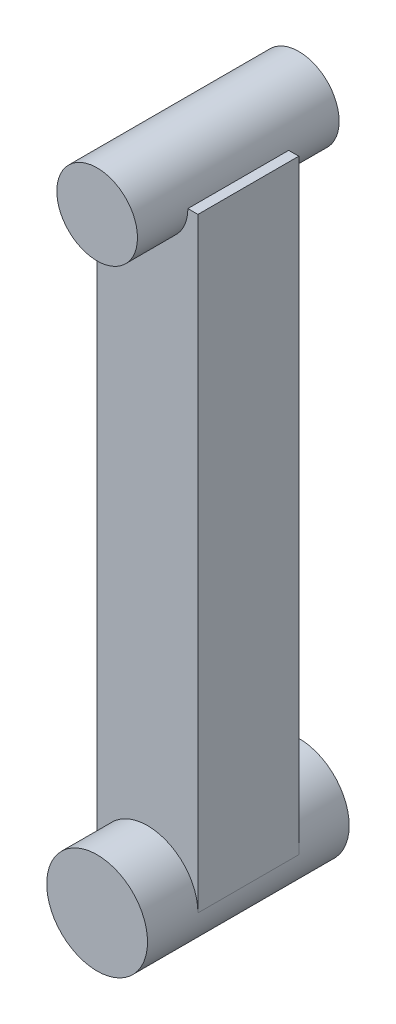
ISO-10303-21;
HEADER;
FILE_DESCRIPTION(('STEP AP214'),'2;1');
FILE_NAME('part.step','',(''),(''),'','','');
FILE_SCHEMA(('AUTOMOTIVE_DESIGN { 1 0 10303 214 1 1 1 1 }'));
ENDSEC;
DATA;
#1=APPLICATION_CONTEXT('core data for automotive mechanical design processes');
#2=APPLICATION_PROTOCOL_DEFINITION('international standard','automotive_design',2000,#1);
#3=PRODUCT_CONTEXT('',#1,'mechanical');
#4=PRODUCT('Part','Part','',(#3));
#5=PRODUCT_RELATED_PRODUCT_CATEGORY('part','',(#4));
#6=PRODUCT_DEFINITION_FORMATION('','',#4);
#7=PRODUCT_DEFINITION_CONTEXT('part definition',#1,'design');
#8=PRODUCT_DEFINITION('design','',#6,#7);
#9=PRODUCT_DEFINITION_SHAPE('','',#8);
#10=(LENGTH_UNIT() NAMED_UNIT(*) SI_UNIT(.MILLI.,.METRE.));
#11=(NAMED_UNIT(*) PLANE_ANGLE_UNIT() SI_UNIT($,.RADIAN.));
#12=(NAMED_UNIT(*) SI_UNIT($,.STERADIAN.) SOLID_ANGLE_UNIT());
#13=UNCERTAINTY_MEASURE_WITH_UNIT(LENGTH_MEASURE(1.E-05),#10,'distance_accuracy_value','');
#14=(GEOMETRIC_REPRESENTATION_CONTEXT(3) GLOBAL_UNCERTAINTY_ASSIGNED_CONTEXT((#13)) GLOBAL_UNIT_ASSIGNED_CONTEXT((#10,
#11,#12)) REPRESENTATION_CONTEXT('',''));
#15=CARTESIAN_POINT('',(0.,0.,0.));
#16=DIRECTION('',(0.,0.,1.));
#17=DIRECTION('',(1.,0.,0.));
#18=AXIS2_PLACEMENT_3D('',#15,#16,#17);
#19=CARTESIAN_POINT('',(0.,0.,-30.));
#20=DIRECTION('',(0.,0.,1.));
#21=DIRECTION('',(1.,0.,0.));
#22=AXIS2_PLACEMENT_3D('',#19,#20,#21);
#23=CYLINDRICAL_SURFACE('',#22,15.);
#24=CARTESIAN_POINT('',(0.,0.,30.));
#25=DIRECTION('',(0.,0.,1.));
#26=DIRECTION('',(1.,0.,0.));
#27=AXIS2_PLACEMENT_3D('',#24,#25,#26);
#28=CIRCLE('',#27,15.);
#29=CARTESIAN_POINT('',(15.,0.,30.));
#30=VERTEX_POINT('',#29);
#31=EDGE_CURVE('E145',#30,#30,#28,.T.);
#32=ORIENTED_EDGE('',*,*,#31,.F.);
#33=EDGE_LOOP('',(#32));
#34=FACE_BOUND('',#33,.T.);
#35=CARTESIAN_POINT('',(0.,0.,-30.));
#36=DIRECTION('',(0.,0.,1.));
#37=DIRECTION('',(1.,0.,0.));
#38=AXIS2_PLACEMENT_3D('',#35,#36,#37);
#39=CIRCLE('',#38,15.);
#40=CARTESIAN_POINT('',(15.,0.,-30.));
#41=VERTEX_POINT('',#40);
#42=EDGE_CURVE('E136',#41,#41,#39,.T.);
#43=ORIENTED_EDGE('',*,*,#42,.T.);
#44=EDGE_LOOP('',(#43));
#45=FACE_BOUND('',#44,.T.);
#46=CARTESIAN_POINT('',(0.,0.,-15.));
#47=DIRECTION('',(0.,0.,1.));
#48=DIRECTION('',(1.,0.,0.));
#49=AXIS2_PLACEMENT_3D('',#46,#47,#48);
#50=CIRCLE('',#49,15.);
#51=CARTESIAN_POINT('',(15.,0.,-15.));
#52=VERTEX_POINT('',#51);
#53=CARTESIAN_POINT('',(-15.,0.,-15.));
#54=VERTEX_POINT('',#53);
#55=EDGE_CURVE('E110',#52,#54,#50,.T.);
#56=ORIENTED_EDGE('',*,*,#55,.F.);
#57=DIRECTION('',(0.,0.,-1.));
#58=VECTOR('',#57,1.);
#59=CARTESIAN_POINT('',(15.,0.,15.));
#60=LINE('',#59,#58);
#61=CARTESIAN_POINT('',(15.,0.,15.));
#62=VERTEX_POINT('',#61);
#63=EDGE_CURVE('E125',#62,#52,#60,.T.);
#64=ORIENTED_EDGE('',*,*,#63,.F.);
#65=CARTESIAN_POINT('',(0.,0.,15.));
#66=DIRECTION('',(0.,0.,-1.));
#67=DIRECTION('',(-1.,0.,0.));
#68=AXIS2_PLACEMENT_3D('',#65,#66,#67);
#69=CIRCLE('',#68,15.);
#70=CARTESIAN_POINT('',(-15.,0.,15.));
#71=VERTEX_POINT('',#70);
#72=EDGE_CURVE('E78',#71,#62,#69,.T.);
#73=ORIENTED_EDGE('',*,*,#72,.F.);
#74=DIRECTION('',(0.,0.,1.));
#75=VECTOR('',#74,1.);
#76=CARTESIAN_POINT('',(-15.,0.,15.));
#77=LINE('',#76,#75);
#78=EDGE_CURVE('E123',#54,#71,#77,.T.);
#79=ORIENTED_EDGE('',*,*,#78,.F.);
#80=EDGE_LOOP('',(#56,#64,#73,#79));
#81=FACE_BOUND('',#80,.T.);
#82=ADVANCED_FACE('F39',(#34,#45,#81),#23,.T.);
#83=CARTESIAN_POINT('',(0.,0.,-30.));
#84=DIRECTION('',(0.,0.,1.));
#85=DIRECTION('',(1.,0.,0.));
#86=AXIS2_PLACEMENT_3D('',#83,#84,#85);
#87=PLANE('',#86);
#88=ORIENTED_EDGE('',*,*,#42,.F.);
#89=EDGE_LOOP('',(#88));
#90=FACE_BOUND('',#89,.T.);
#91=ADVANCED_FACE('F168',(#90),#87,.F.);
#92=CARTESIAN_POINT('',(0.,0.,30.));
#93=DIRECTION('',(0.,0.,1.));
#94=DIRECTION('',(1.,0.,0.));
#95=AXIS2_PLACEMENT_3D('',#92,#93,#94);
#96=PLANE('',#95);
#97=ORIENTED_EDGE('',*,*,#31,.T.);
#98=EDGE_LOOP('',(#97));
#99=FACE_BOUND('',#98,.T.);
#100=ADVANCED_FACE('F171',(#99),#96,.T.);
#101=CARTESIAN_POINT('',(0.,180.,0.));
#102=DIRECTION('',(0.,-1.,0.));
#103=DIRECTION('',(0.,0.,-1.));
#104=AXIS2_PLACEMENT_3D('',#101,#102,#103);
#105=PLANE('',#104);
#106=DIRECTION('',(-1.,0.,0.));
#107=VECTOR('',#106,1.);
#108=CARTESIAN_POINT('',(-15.,180.,-15.));
#109=LINE('',#108,#107);
#110=CARTESIAN_POINT('',(15.,180.,-15.));
#111=VERTEX_POINT('',#110);
#112=CARTESIAN_POINT('',(12.,180.,-15.));
#113=VERTEX_POINT('',#112);
#114=EDGE_CURVE('E100',#111,#113,#109,.T.);
#115=ORIENTED_EDGE('',*,*,#114,.T.);
#116=DIRECTION('',(0.,0.,1.));
#117=VECTOR('',#116,1.);
#118=CARTESIAN_POINT('',(12.,180.,-30.));
#119=LINE('',#118,#117);
#120=CARTESIAN_POINT('',(12.,180.,15.));
#121=VERTEX_POINT('',#120);
#122=EDGE_CURVE('E11',#113,#121,#119,.T.);
#123=ORIENTED_EDGE('',*,*,#122,.T.);
#124=DIRECTION('',(1.,0.,0.));
#125=VECTOR('',#124,1.);
#126=CARTESIAN_POINT('',(-15.,180.,15.));
#127=LINE('',#126,#125);
#128=CARTESIAN_POINT('',(15.,180.,15.));
#129=VERTEX_POINT('',#128);
#130=EDGE_CURVE('E64',#121,#129,#127,.T.);
#131=ORIENTED_EDGE('',*,*,#130,.T.);
#132=DIRECTION('',(0.,0.,-1.));
#133=VECTOR('',#132,1.);
#134=CARTESIAN_POINT('',(15.,180.,15.));
#135=LINE('',#134,#133);
#136=EDGE_CURVE('E98',#129,#111,#135,.T.);
#137=ORIENTED_EDGE('',*,*,#136,.T.);
#138=EDGE_LOOP('',(#115,#123,#131,#137));
#139=FACE_BOUND('',#138,.T.);
#140=ADVANCED_FACE('F155',(#139),#105,.F.);
#141=CARTESIAN_POINT('',(15.,180.,15.));
#142=DIRECTION('',(-1.,0.,0.));
#143=DIRECTION('',(0.,0.,1.));
#144=AXIS2_PLACEMENT_3D('',#141,#142,#143);
#145=PLANE('',#144);
#146=ORIENTED_EDGE('',*,*,#63,.T.);
#147=DIRECTION('',(0.,-1.,0.));
#148=VECTOR('',#147,1.);
#149=CARTESIAN_POINT('',(15.,180.,-15.));
#150=LINE('',#149,#148);
#151=EDGE_CURVE('E108',#111,#52,#150,.T.);
#152=ORIENTED_EDGE('',*,*,#151,.F.);
#153=ORIENTED_EDGE('',*,*,#136,.F.);
#154=DIRECTION('',(0.,-1.,0.));
#155=VECTOR('',#154,1.);
#156=CARTESIAN_POINT('',(15.,180.,15.));
#157=LINE('',#156,#155);
#158=EDGE_CURVE('E122',#129,#62,#157,.T.);
#159=ORIENTED_EDGE('',*,*,#158,.T.);
#160=EDGE_LOOP('',(#146,#152,#153,#159));
#161=FACE_BOUND('',#160,.T.);
#162=ADVANCED_FACE('F41',(#161),#145,.F.);
#163=CARTESIAN_POINT('',(-15.,180.,-15.));
#164=DIRECTION('',(0.,0.,1.));
#165=DIRECTION('',(1.,0.,0.));
#166=AXIS2_PLACEMENT_3D('',#163,#164,#165);
#167=PLANE('',#166);
#168=ORIENTED_EDGE('',*,*,#151,.T.);
#169=ORIENTED_EDGE('',*,*,#55,.T.);
#170=DIRECTION('',(0.,-1.,0.));
#171=VECTOR('',#170,1.);
#172=CARTESIAN_POINT('',(-15.,180.,-15.));
#173=LINE('',#172,#171);
#174=CARTESIAN_POINT('',(-15.,180.,-15.));
#175=VERTEX_POINT('',#174);
#176=EDGE_CURVE('E105',#175,#54,#173,.T.);
#177=ORIENTED_EDGE('',*,*,#176,.F.);
#178=CARTESIAN_POINT('',(-12.,180.,-15.));
#179=VERTEX_POINT('',#178);
#180=EDGE_CURVE('E90',#179,#175,#109,.T.);
#181=ORIENTED_EDGE('',*,*,#180,.F.);
#182=CARTESIAN_POINT('',(0.,180.,-15.));
#183=DIRECTION('',(0.,0.,1.));
#184=DIRECTION('',(1.,0.,0.));
#185=AXIS2_PLACEMENT_3D('',#182,#183,#184);
#186=CIRCLE('',#185,12.);
#187=EDGE_CURVE('E53',#179,#113,#186,.T.);
#188=ORIENTED_EDGE('',*,*,#187,.T.);
#189=ORIENTED_EDGE('',*,*,#114,.F.);
#190=EDGE_LOOP('',(#168,#169,#177,#181,#188,#189));
#191=FACE_BOUND('',#190,.T.);
#192=ADVANCED_FACE('F102',(#191),#167,.F.);
#193=CARTESIAN_POINT('',(-15.,180.,15.));
#194=DIRECTION('',(1.,0.,0.));
#195=DIRECTION('',(0.,0.,-1.));
#196=AXIS2_PLACEMENT_3D('',#193,#194,#195);
#197=PLANE('',#196);
#198=ORIENTED_EDGE('',*,*,#78,.T.);
#199=DIRECTION('',(0.,-1.,0.));
#200=VECTOR('',#199,1.);
#201=CARTESIAN_POINT('',(-15.,180.,15.));
#202=LINE('',#201,#200);
#203=CARTESIAN_POINT('',(-15.,180.,15.));
#204=VERTEX_POINT('',#203);
#205=EDGE_CURVE('E109',#204,#71,#202,.T.);
#206=ORIENTED_EDGE('',*,*,#205,.F.);
#207=DIRECTION('',(0.,0.,1.));
#208=VECTOR('',#207,1.);
#209=CARTESIAN_POINT('',(-15.,180.,15.));
#210=LINE('',#209,#208);
#211=EDGE_CURVE('E94',#175,#204,#210,.T.);
#212=ORIENTED_EDGE('',*,*,#211,.F.);
#213=ORIENTED_EDGE('',*,*,#176,.T.);
#214=EDGE_LOOP('',(#198,#206,#212,#213));
#215=FACE_BOUND('',#214,.T.);
#216=ADVANCED_FACE('F115',(#215),#197,.F.);
#217=CARTESIAN_POINT('',(-15.,180.,15.));
#218=DIRECTION('',(0.,0.,-1.));
#219=DIRECTION('',(-1.,0.,0.));
#220=AXIS2_PLACEMENT_3D('',#217,#218,#219);
#221=PLANE('',#220);
#222=ORIENTED_EDGE('',*,*,#205,.T.);
#223=ORIENTED_EDGE('',*,*,#72,.T.);
#224=ORIENTED_EDGE('',*,*,#158,.F.);
#225=ORIENTED_EDGE('',*,*,#130,.F.);
#226=CARTESIAN_POINT('',(0.,180.,15.));
#227=DIRECTION('',(0.,0.,-1.));
#228=DIRECTION('',(-1.,0.,0.));
#229=AXIS2_PLACEMENT_3D('',#226,#227,#228);
#230=CIRCLE('',#229,12.);
#231=CARTESIAN_POINT('',(-12.,180.,15.));
#232=VERTEX_POINT('',#231);
#233=EDGE_CURVE('E143',#121,#232,#230,.T.);
#234=ORIENTED_EDGE('',*,*,#233,.T.);
#235=EDGE_CURVE('E118',#204,#232,#127,.T.);
#236=ORIENTED_EDGE('',*,*,#235,.F.);
#237=EDGE_LOOP('',(#222,#223,#224,#225,#234,#236));
#238=FACE_BOUND('',#237,.T.);
#239=ADVANCED_FACE('F139',(#238),#221,.F.);
#240=ORIENTED_EDGE('',*,*,#235,.T.);
#241=DIRECTION('',(0.,0.,1.));
#242=VECTOR('',#241,1.);
#243=CARTESIAN_POINT('',(-12.,180.,-30.));
#244=LINE('',#243,#242);
#245=EDGE_CURVE('E50',#232,#179,#244,.F.);
#246=ORIENTED_EDGE('',*,*,#245,.T.);
#247=ORIENTED_EDGE('',*,*,#180,.T.);
#248=ORIENTED_EDGE('',*,*,#211,.T.);
#249=EDGE_LOOP('',(#240,#246,#247,#248));
#250=FACE_BOUND('',#249,.T.);
#251=ADVANCED_FACE('F95',(#250),#105,.F.);
#252=CARTESIAN_POINT('',(0.,180.,-30.));
#253=DIRECTION('',(0.,0.,1.));
#254=DIRECTION('',(1.,0.,0.));
#255=AXIS2_PLACEMENT_3D('',#252,#253,#254);
#256=CYLINDRICAL_SURFACE('',#255,12.);
#257=CARTESIAN_POINT('',(0.,180.,30.));
#258=DIRECTION('',(0.,0.,1.));
#259=DIRECTION('',(1.,0.,0.));
#260=AXIS2_PLACEMENT_3D('',#257,#258,#259);
#261=CIRCLE('',#260,12.);
#262=CARTESIAN_POINT('',(12.,180.,30.));
#263=VERTEX_POINT('',#262);
#264=EDGE_CURVE('E150',#263,#263,#261,.T.);
#265=ORIENTED_EDGE('',*,*,#264,.F.);
#266=EDGE_LOOP('',(#265));
#267=FACE_BOUND('',#266,.T.);
#268=CARTESIAN_POINT('',(0.,180.,-30.));
#269=DIRECTION('',(0.,0.,1.));
#270=DIRECTION('',(1.,0.,0.));
#271=AXIS2_PLACEMENT_3D('',#268,#269,#270);
#272=CIRCLE('',#271,12.);
#273=CARTESIAN_POINT('',(12.,180.,-30.));
#274=VERTEX_POINT('',#273);
#275=EDGE_CURVE('E190',#274,#274,#272,.T.);
#276=ORIENTED_EDGE('',*,*,#275,.T.);
#277=EDGE_LOOP('',(#276));
#278=FACE_BOUND('',#277,.T.);
#279=ORIENTED_EDGE('',*,*,#122,.F.);
#280=ORIENTED_EDGE('',*,*,#187,.F.);
#281=ORIENTED_EDGE('',*,*,#245,.F.);
#282=ORIENTED_EDGE('',*,*,#233,.F.);
#283=EDGE_LOOP('',(#279,#280,#281,#282));
#284=FACE_BOUND('',#283,.T.);
#285=ADVANCED_FACE('F153',(#267,#278,#284),#256,.T.);
#286=CARTESIAN_POINT('',(0.,180.,-30.));
#287=DIRECTION('',(0.,0.,1.));
#288=DIRECTION('',(1.,0.,0.));
#289=AXIS2_PLACEMENT_3D('',#286,#287,#288);
#290=PLANE('',#289);
#291=ORIENTED_EDGE('',*,*,#275,.F.);
#292=EDGE_LOOP('',(#291));
#293=FACE_BOUND('',#292,.T.);
#294=ADVANCED_FACE('F154',(#293),#290,.F.);
#295=CARTESIAN_POINT('',(0.,180.,30.));
#296=DIRECTION('',(0.,0.,1.));
#297=DIRECTION('',(1.,0.,0.));
#298=AXIS2_PLACEMENT_3D('',#295,#296,#297);
#299=PLANE('',#298);
#300=ORIENTED_EDGE('',*,*,#264,.T.);
#301=EDGE_LOOP('',(#300));
#302=FACE_BOUND('',#301,.T.);
#303=ADVANCED_FACE('F165',(#302),#299,.T.);
#304=CLOSED_SHELL('',(#82,#91,#100,#140,#162,#192,#216,#239,#251,#285,#294,#303));
#305=MANIFOLD_SOLID_BREP('B2',#304);
#306=ADVANCED_BREP_SHAPE_REPRESENTATION('',(#18,#305),#14);
#307=SHAPE_DEFINITION_REPRESENTATION(#9,#306);
ENDSEC;
END-ISO-10303-21;
